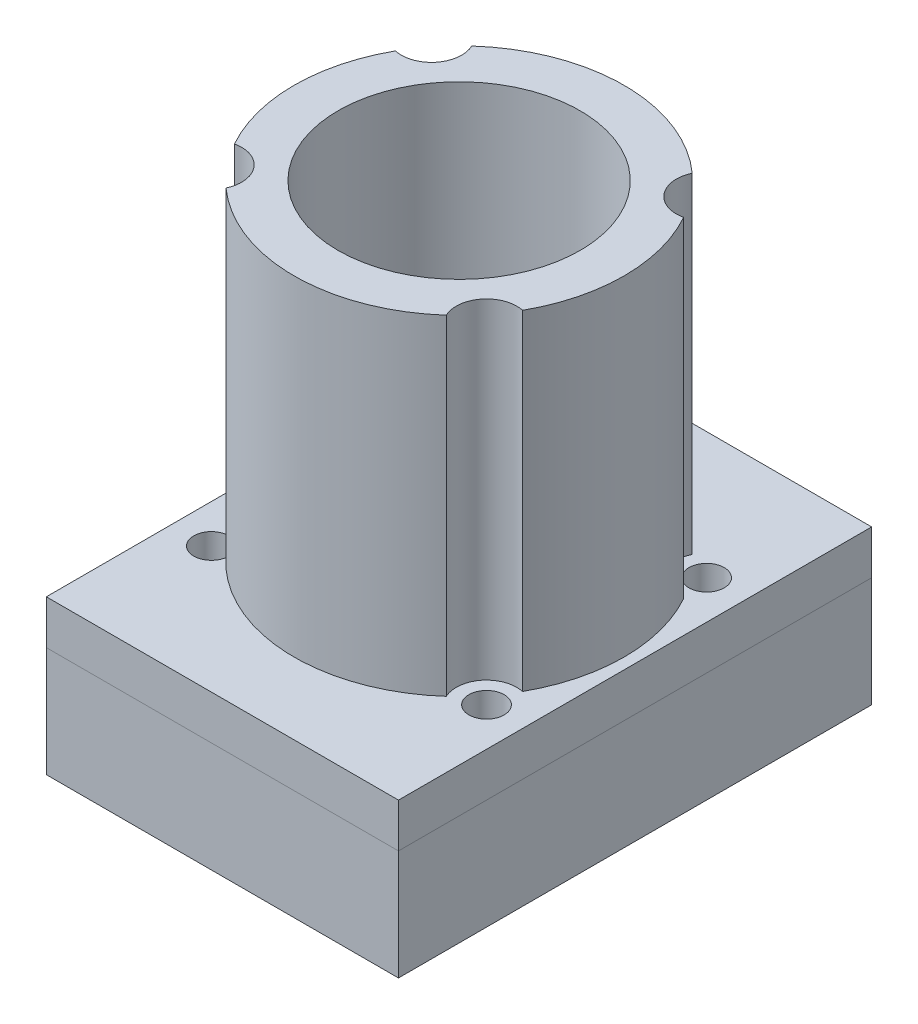
ISO-10303-21;
HEADER;
FILE_DESCRIPTION(('STEP AP214'),'2;1');
FILE_NAME('part.step','',(''),(''),'','','');
FILE_SCHEMA(('AUTOMOTIVE_DESIGN { 1 0 10303 214 1 1 1 1 }'));
ENDSEC;
DATA;
#1=APPLICATION_CONTEXT('core data for automotive mechanical design processes');
#2=APPLICATION_PROTOCOL_DEFINITION('international standard','automotive_design',2000,#1);
#3=PRODUCT_CONTEXT('',#1,'mechanical');
#4=PRODUCT('Part','Part','',(#3));
#5=PRODUCT_RELATED_PRODUCT_CATEGORY('part','',(#4));
#6=PRODUCT_DEFINITION_FORMATION('','',#4);
#7=PRODUCT_DEFINITION_CONTEXT('part definition',#1,'design');
#8=PRODUCT_DEFINITION('design','',#6,#7);
#9=PRODUCT_DEFINITION_SHAPE('','',#8);
#10=(LENGTH_UNIT() NAMED_UNIT(*) SI_UNIT(.MILLI.,.METRE.));
#11=(NAMED_UNIT(*) PLANE_ANGLE_UNIT() SI_UNIT($,.RADIAN.));
#12=(NAMED_UNIT(*) SI_UNIT($,.STERADIAN.) SOLID_ANGLE_UNIT());
#13=UNCERTAINTY_MEASURE_WITH_UNIT(LENGTH_MEASURE(1.E-05),#10,'distance_accuracy_value','');
#14=(GEOMETRIC_REPRESENTATION_CONTEXT(3) GLOBAL_UNCERTAINTY_ASSIGNED_CONTEXT((#13)) GLOBAL_UNIT_ASSIGNED_CONTEXT((#10,
#11,#12)) REPRESENTATION_CONTEXT('',''));
#15=CARTESIAN_POINT('',(0.,0.,0.));
#16=DIRECTION('',(0.,0.,1.));
#17=DIRECTION('',(1.,0.,0.));
#18=AXIS2_PLACEMENT_3D('',#15,#16,#17);
#19=CARTESIAN_POINT('',(-0.329036726473719,58.9480547552622,-9.99092979558486));
#20=DIRECTION('',(0.,-1.,0.));
#21=DIRECTION('',(0.,0.,-1.));
#22=AXIS2_PLACEMENT_3D('',#19,#20,#21);
#23=CYLINDRICAL_SURFACE('',#22,15.);
#24=DIRECTION('',(0.,-1.,0.));
#25=VECTOR('',#24,1.);
#26=CARTESIAN_POINT('',(-13.4198533282119,45.9480547552622,-2.66764360019029));
#27=LINE('',#26,#25);
#28=CARTESIAN_POINT('',(-13.4198533282119,58.9480547552622,-2.66764360019028));
#29=VERTEX_POINT('',#28);
#30=CARTESIAN_POINT('',(-13.4198533282119,28.9480547552622,-2.66764360019029));
#31=VERTEX_POINT('',#30);
#32=EDGE_CURVE('E12',#29,#31,#27,.T.);
#33=ORIENTED_EDGE('',*,*,#32,.F.);
#34=CARTESIAN_POINT('',(-0.329036726473719,58.9480547552622,-9.99092979558486));
#35=DIRECTION('',(0.,1.,0.));
#36=DIRECTION('',(0.,0.,1.));
#37=AXIS2_PLACEMENT_3D('',#34,#35,#36);
#38=CIRCLE('',#37,15.);
#39=CARTESIAN_POINT('',(-13.4288699327141,58.9480547552622,-17.2980749268027));
#40=VERTEX_POINT('',#39);
#41=EDGE_CURVE('E254',#40,#29,#38,.T.);
#42=ORIENTED_EDGE('',*,*,#41,.F.);
#43=DIRECTION('',(0.,-1.,0.));
#44=VECTOR('',#43,1.);
#45=CARTESIAN_POINT('',(-13.4288699327141,45.9480547552622,-17.2980749268027));
#46=LINE('',#45,#44);
#47=CARTESIAN_POINT('',(-13.4288699327141,28.9480547552622,-17.2980749268027));
#48=VERTEX_POINT('',#47);
#49=EDGE_CURVE('E157',#48,#40,#46,.F.);
#50=ORIENTED_EDGE('',*,*,#49,.F.);
#51=CARTESIAN_POINT('',(-0.329036726473719,28.9480547552622,-9.99092979558486));
#52=DIRECTION('',(0.,1.,0.));
#53=DIRECTION('',(0.,0.,1.));
#54=AXIS2_PLACEMENT_3D('',#51,#52,#53);
#55=CIRCLE('',#54,15.);
#56=EDGE_CURVE('E166',#48,#31,#55,.T.);
#57=ORIENTED_EDGE('',*,*,#56,.T.);
#58=EDGE_LOOP('',(#33,#42,#50,#57));
#59=FACE_BOUND('',#58,.T.);
#60=ADVANCED_FACE('F47',(#59),#23,.T.);
#61=DIRECTION('',(0.,-1.,0.));
#62=VECTOR('',#61,1.);
#63=CARTESIAN_POINT('',(-10.3374206699332,45.9480547552622,1.18190560284034));
#64=LINE('',#63,#62);
#65=CARTESIAN_POINT('',(-10.3374206699332,28.9480547552622,1.18190560284034));
#66=VERTEX_POINT('',#65);
#67=CARTESIAN_POINT('',(-10.3374206699332,58.9480547552622,1.18190560284034));
#68=VERTEX_POINT('',#67);
#69=EDGE_CURVE('E55',#66,#68,#64,.F.);
#70=ORIENTED_EDGE('',*,*,#69,.F.);
#71=CARTESIAN_POINT('',(9.67934721698572,28.9480547552622,1.18190560284034));
#72=VERTEX_POINT('',#71);
#73=EDGE_CURVE('E174',#66,#72,#55,.T.);
#74=ORIENTED_EDGE('',*,*,#73,.T.);
#75=DIRECTION('',(0.,-1.,0.));
#76=VECTOR('',#75,1.);
#77=CARTESIAN_POINT('',(9.67934721698572,45.9480547552622,1.18190560284034));
#78=LINE('',#77,#76);
#79=CARTESIAN_POINT('',(9.67934721698573,58.9480547552622,1.18190560284034));
#80=VERTEX_POINT('',#79);
#81=EDGE_CURVE('E237',#80,#72,#78,.T.);
#82=ORIENTED_EDGE('',*,*,#81,.F.);
#83=EDGE_CURVE('E179',#68,#80,#38,.T.);
#84=ORIENTED_EDGE('',*,*,#83,.F.);
#85=EDGE_LOOP('',(#70,#74,#82,#84));
#86=FACE_BOUND('',#85,.T.);
#87=ADVANCED_FACE('F259',(#86),#23,.T.);
#88=DIRECTION('',(0.,-1.,0.));
#89=VECTOR('',#88,1.);
#90=CARTESIAN_POINT('',(12.7617798752644,45.9480547552622,-2.66764360019029));
#91=LINE('',#90,#89);
#92=CARTESIAN_POINT('',(12.7617798752644,28.9480547552622,-2.66764360019029));
#93=VERTEX_POINT('',#92);
#94=CARTESIAN_POINT('',(12.7617798752644,58.9480547552622,-2.66764360019029));
#95=VERTEX_POINT('',#94);
#96=EDGE_CURVE('E235',#93,#95,#91,.F.);
#97=ORIENTED_EDGE('',*,*,#96,.F.);
#98=CARTESIAN_POINT('',(12.7707964797667,28.9480547552622,-17.2980749268027));
#99=VERTEX_POINT('',#98);
#100=EDGE_CURVE('E171',#93,#99,#55,.T.);
#101=ORIENTED_EDGE('',*,*,#100,.T.);
#102=DIRECTION('',(0.,-1.,0.));
#103=VECTOR('',#102,1.);
#104=CARTESIAN_POINT('',(12.7707964797667,45.9480547552622,-17.2980749268027));
#105=LINE('',#104,#103);
#106=CARTESIAN_POINT('',(12.7707964797667,58.9480547552622,-17.2980749268027));
#107=VERTEX_POINT('',#106);
#108=EDGE_CURVE('E233',#107,#99,#105,.T.);
#109=ORIENTED_EDGE('',*,*,#108,.F.);
#110=EDGE_CURVE('E188',#95,#107,#38,.T.);
#111=ORIENTED_EDGE('',*,*,#110,.F.);
#112=EDGE_LOOP('',(#97,#101,#109,#111));
#113=FACE_BOUND('',#112,.T.);
#114=ADVANCED_FACE('F276',(#113),#23,.T.);
#115=DIRECTION('',(0.,-1.,0.));
#116=VECTOR('',#115,1.);
#117=CARTESIAN_POINT('',(9.68534797677265,45.9480547552622,-21.1583869374496));
#118=LINE('',#117,#116);
#119=CARTESIAN_POINT('',(9.68534797677264,28.9480547552622,-21.1583869374496));
#120=VERTEX_POINT('',#119);
#121=CARTESIAN_POINT('',(9.68534797677264,58.9480547552622,-21.1583869374496));
#122=VERTEX_POINT('',#121);
#123=EDGE_CURVE('E156',#120,#122,#118,.F.);
#124=ORIENTED_EDGE('',*,*,#123,.F.);
#125=CARTESIAN_POINT('',(-10.3434214297201,28.9480547552622,-21.1583869374496));
#126=VERTEX_POINT('',#125);
#127=EDGE_CURVE('E163',#120,#126,#55,.T.);
#128=ORIENTED_EDGE('',*,*,#127,.T.);
#129=DIRECTION('',(0.,-1.,0.));
#130=VECTOR('',#129,1.);
#131=CARTESIAN_POINT('',(-10.3434214297201,45.9480547552622,-21.1583869374496));
#132=LINE('',#131,#130);
#133=CARTESIAN_POINT('',(-10.3434214297201,58.9480547552622,-21.1583869374496));
#134=VERTEX_POINT('',#133);
#135=EDGE_CURVE('E145',#134,#126,#132,.T.);
#136=ORIENTED_EDGE('',*,*,#135,.F.);
#137=EDGE_CURVE('E260',#122,#134,#38,.T.);
#138=ORIENTED_EDGE('',*,*,#137,.F.);
#139=EDGE_LOOP('',(#124,#128,#136,#138));
#140=FACE_BOUND('',#139,.T.);
#141=ADVANCED_FACE('F170',(#140),#23,.T.);
#142=CARTESIAN_POINT('',(0.,28.9480547552622,0.));
#143=DIRECTION('',(0.,1.,0.));
#144=DIRECTION('',(0.,0.,1.));
#145=AXIS2_PLACEMENT_3D('',#142,#143,#144);
#146=PLANE('',#145);
#147=ORIENTED_EDGE('',*,*,#73,.F.);
#148=CARTESIAN_POINT('',(-12.8290367264737,28.9480547552622,0.0181404088302802));
#149=DIRECTION('',(0.,1.,0.));
#150=DIRECTION('',(0.,0.,1.));
#151=AXIS2_PLACEMENT_3D('',#148,#149,#150);
#152=CIRCLE('',#151,2.75);
#153=EDGE_CURVE('E244',#66,#31,#152,.T.);
#154=ORIENTED_EDGE('',*,*,#153,.T.);
#155=ORIENTED_EDGE('',*,*,#56,.F.);
#156=CARTESIAN_POINT('',(-12.8290367264737,28.9480547552622,-19.9818595911697));
#157=DIRECTION('',(0.,1.,0.));
#158=DIRECTION('',(0.,0.,1.));
#159=AXIS2_PLACEMENT_3D('',#156,#157,#158);
#160=CIRCLE('',#159,2.75);
#161=EDGE_CURVE('E148',#48,#126,#160,.T.);
#162=ORIENTED_EDGE('',*,*,#161,.T.);
#163=ORIENTED_EDGE('',*,*,#127,.F.);
#164=CARTESIAN_POINT('',(12.1709632735263,28.9480547552622,-19.9818595911697));
#165=DIRECTION('',(0.,1.,0.));
#166=DIRECTION('',(0.,0.,1.));
#167=AXIS2_PLACEMENT_3D('',#164,#165,#166);
#168=CIRCLE('',#167,2.75);
#169=EDGE_CURVE('E167',#120,#99,#168,.T.);
#170=ORIENTED_EDGE('',*,*,#169,.T.);
#171=ORIENTED_EDGE('',*,*,#100,.F.);
#172=CARTESIAN_POINT('',(12.1709632735263,28.9480547552622,0.0181404088302802));
#173=DIRECTION('',(0.,1.,0.));
#174=DIRECTION('',(0.,0.,1.));
#175=AXIS2_PLACEMENT_3D('',#172,#173,#174);
#176=CIRCLE('',#175,2.75);
#177=EDGE_CURVE('E62',#93,#72,#176,.T.);
#178=ORIENTED_EDGE('',*,*,#177,.T.);
#179=EDGE_LOOP('',(#147,#154,#155,#162,#163,#170,#171,#178));
#180=FACE_BOUND('',#179,.T.);
#181=DIRECTION('',(1.,0.,0.));
#182=VECTOR('',#181,1.);
#183=CARTESIAN_POINT('',(-16.3290367264737,28.9480547552622,11.5181404088303));
#184=LINE('',#183,#182);
#185=CARTESIAN_POINT('',(-16.3290367264737,28.9480547552622,11.5181404088303));
#186=VERTEX_POINT('',#185);
#187=CARTESIAN_POINT('',(15.6709632735263,28.9480547552622,11.5181404088303));
#188=VERTEX_POINT('',#187);
#189=EDGE_CURVE('E210',#186,#188,#184,.T.);
#190=ORIENTED_EDGE('',*,*,#189,.T.);
#191=DIRECTION('',(0.,0.,-1.));
#192=VECTOR('',#191,1.);
#193=CARTESIAN_POINT('',(15.6709632735263,28.9480547552622,11.5181404088303));
#194=LINE('',#193,#192);
#195=CARTESIAN_POINT('',(15.6709632735263,28.9480547552622,-31.4818595911697));
#196=VERTEX_POINT('',#195);
#197=EDGE_CURVE('E100',#188,#196,#194,.T.);
#198=ORIENTED_EDGE('',*,*,#197,.T.);
#199=DIRECTION('',(-1.,0.,0.));
#200=VECTOR('',#199,1.);
#201=CARTESIAN_POINT('',(15.6709632735263,28.9480547552622,-31.4818595911697));
#202=LINE('',#201,#200);
#203=CARTESIAN_POINT('',(-16.3290367264737,28.9480547552622,-31.4818595911697));
#204=VERTEX_POINT('',#203);
#205=EDGE_CURVE('E213',#196,#204,#202,.T.);
#206=ORIENTED_EDGE('',*,*,#205,.T.);
#207=DIRECTION('',(0.,0.,1.));
#208=VECTOR('',#207,1.);
#209=CARTESIAN_POINT('',(-16.3290367264737,28.9480547552622,-31.4818595911697));
#210=LINE('',#209,#208);
#211=EDGE_CURVE('E71',#204,#186,#210,.T.);
#212=ORIENTED_EDGE('',*,*,#211,.T.);
#213=EDGE_LOOP('',(#190,#198,#206,#212));
#214=FACE_BOUND('',#213,.T.);
#215=CARTESIAN_POINT('',(-12.8290367264737,28.9480547552622,-19.9818595911697));
#216=DIRECTION('',(0.,1.,0.));
#217=DIRECTION('',(0.,0.,1.));
#218=AXIS2_PLACEMENT_3D('',#215,#216,#217);
#219=CIRCLE('',#218,1.6);
#220=CARTESIAN_POINT('',(-12.8290367264737,28.9480547552622,-18.3818595911697));
#221=VERTEX_POINT('',#220);
#222=EDGE_CURVE('E189',#221,#221,#219,.T.);
#223=ORIENTED_EDGE('',*,*,#222,.F.);
#224=EDGE_LOOP('',(#223));
#225=FACE_BOUND('',#224,.T.);
#226=CARTESIAN_POINT('',(12.1709632735263,28.9480547552622,-19.9818595911697));
#227=DIRECTION('',(0.,1.,0.));
#228=DIRECTION('',(0.,0.,1.));
#229=AXIS2_PLACEMENT_3D('',#226,#227,#228);
#230=CIRCLE('',#229,1.6);
#231=CARTESIAN_POINT('',(12.1709632735263,28.9480547552622,-18.3818595911697));
#232=VERTEX_POINT('',#231);
#233=EDGE_CURVE('E181',#232,#232,#230,.T.);
#234=ORIENTED_EDGE('',*,*,#233,.F.);
#235=EDGE_LOOP('',(#234));
#236=FACE_BOUND('',#235,.T.);
#237=CARTESIAN_POINT('',(12.1709632735263,28.9480547552622,0.0181404088302802));
#238=DIRECTION('',(0.,1.,0.));
#239=DIRECTION('',(0.,0.,1.));
#240=AXIS2_PLACEMENT_3D('',#237,#238,#239);
#241=CIRCLE('',#240,1.6);
#242=CARTESIAN_POINT('',(12.1709632735263,28.9480547552622,1.61814040883028));
#243=VERTEX_POINT('',#242);
#244=EDGE_CURVE('E201',#243,#243,#241,.T.);
#245=ORIENTED_EDGE('',*,*,#244,.F.);
#246=EDGE_LOOP('',(#245));
#247=FACE_BOUND('',#246,.T.);
#248=CARTESIAN_POINT('',(-12.8290367264737,28.9480547552622,0.0181404088302802));
#249=DIRECTION('',(0.,1.,0.));
#250=DIRECTION('',(0.,0.,1.));
#251=AXIS2_PLACEMENT_3D('',#248,#249,#250);
#252=CIRCLE('',#251,1.6);
#253=CARTESIAN_POINT('',(-12.8290367264737,28.9480547552622,1.61814040883028));
#254=VERTEX_POINT('',#253);
#255=EDGE_CURVE('E195',#254,#254,#252,.T.);
#256=ORIENTED_EDGE('',*,*,#255,.F.);
#257=EDGE_LOOP('',(#256));
#258=FACE_BOUND('',#257,.T.);
#259=ADVANCED_FACE('F161',(#180,#214,#225,#236,#247,#258),#146,.T.);
#260=CARTESIAN_POINT('',(0.,24.9480547552622,0.));
#261=DIRECTION('',(0.,1.,0.));
#262=DIRECTION('',(0.,0.,1.));
#263=AXIS2_PLACEMENT_3D('',#260,#261,#262);
#264=PLANE('',#263);
#265=DIRECTION('',(1.,0.,0.));
#266=VECTOR('',#265,1.);
#267=CARTESIAN_POINT('',(-16.3290367264737,24.9480547552622,11.5181404088303));
#268=LINE('',#267,#266);
#269=CARTESIAN_POINT('',(-16.3290367264737,24.9480547552622,11.5181404088303));
#270=VERTEX_POINT('',#269);
#271=CARTESIAN_POINT('',(15.6709632735263,24.9480547552622,11.5181404088303));
#272=VERTEX_POINT('',#271);
#273=EDGE_CURVE('E209',#270,#272,#268,.T.);
#274=ORIENTED_EDGE('',*,*,#273,.F.);
#275=DIRECTION('',(0.,0.,1.));
#276=VECTOR('',#275,1.);
#277=CARTESIAN_POINT('',(-16.3290367264737,24.9480547552622,-31.4818595911697));
#278=LINE('',#277,#276);
#279=CARTESIAN_POINT('',(-16.3290367264737,24.9480547552622,-31.4818595911697));
#280=VERTEX_POINT('',#279);
#281=EDGE_CURVE('E92',#280,#270,#278,.T.);
#282=ORIENTED_EDGE('',*,*,#281,.F.);
#283=DIRECTION('',(-1.,0.,0.));
#284=VECTOR('',#283,1.);
#285=CARTESIAN_POINT('',(15.6709632735263,24.9480547552622,-31.4818595911697));
#286=LINE('',#285,#284);
#287=CARTESIAN_POINT('',(15.6709632735263,24.9480547552622,-31.4818595911697));
#288=VERTEX_POINT('',#287);
#289=EDGE_CURVE('E221',#288,#280,#286,.T.);
#290=ORIENTED_EDGE('',*,*,#289,.F.);
#291=DIRECTION('',(0.,0.,-1.));
#292=VECTOR('',#291,1.);
#293=CARTESIAN_POINT('',(15.6709632735263,24.9480547552622,11.5181404088303));
#294=LINE('',#293,#292);
#295=EDGE_CURVE('E219',#272,#288,#294,.T.);
#296=ORIENTED_EDGE('',*,*,#295,.F.);
#297=EDGE_LOOP('',(#274,#282,#290,#296));
#298=FACE_BOUND('',#297,.T.);
#299=CARTESIAN_POINT('',(-0.329036726473719,24.9480547552622,-9.99092979558486));
#300=DIRECTION('',(0.,1.,0.));
#301=DIRECTION('',(0.,0.,1.));
#302=AXIS2_PLACEMENT_3D('',#299,#300,#301);
#303=CIRCLE('',#302,11.);
#304=CARTESIAN_POINT('',(-0.329036726473719,24.9480547552622,1.00907020441514));
#305=VERTEX_POINT('',#304);
#306=EDGE_CURVE('E204',#305,#305,#303,.T.);
#307=ORIENTED_EDGE('',*,*,#306,.T.);
#308=EDGE_LOOP('',(#307));
#309=FACE_BOUND('',#308,.T.);
#310=CARTESIAN_POINT('',(12.1709632735263,24.9480547552622,0.0181404088302802));
#311=DIRECTION('',(0.,1.,0.));
#312=DIRECTION('',(0.,0.,1.));
#313=AXIS2_PLACEMENT_3D('',#310,#311,#312);
#314=CIRCLE('',#313,1.6);
#315=CARTESIAN_POINT('',(12.1709632735263,24.9480547552622,1.61814040883028));
#316=VERTEX_POINT('',#315);
#317=EDGE_CURVE('E198',#316,#316,#314,.T.);
#318=ORIENTED_EDGE('',*,*,#317,.T.);
#319=EDGE_LOOP('',(#318));
#320=FACE_BOUND('',#319,.T.);
#321=CARTESIAN_POINT('',(-12.8290367264737,24.9480547552622,0.0181404088302802));
#322=DIRECTION('',(0.,1.,0.));
#323=DIRECTION('',(0.,0.,1.));
#324=AXIS2_PLACEMENT_3D('',#321,#322,#323);
#325=CIRCLE('',#324,1.6);
#326=CARTESIAN_POINT('',(-12.8290367264737,24.9480547552622,1.61814040883028));
#327=VERTEX_POINT('',#326);
#328=EDGE_CURVE('E192',#327,#327,#325,.T.);
#329=ORIENTED_EDGE('',*,*,#328,.T.);
#330=EDGE_LOOP('',(#329));
#331=FACE_BOUND('',#330,.T.);
#332=CARTESIAN_POINT('',(-12.8290367264737,24.9480547552622,-19.9818595911697));
#333=DIRECTION('',(0.,1.,0.));
#334=DIRECTION('',(0.,0.,1.));
#335=AXIS2_PLACEMENT_3D('',#332,#333,#334);
#336=CIRCLE('',#335,1.6);
#337=CARTESIAN_POINT('',(-12.8290367264737,24.9480547552622,-18.3818595911697));
#338=VERTEX_POINT('',#337);
#339=EDGE_CURVE('E184',#338,#338,#336,.T.);
#340=ORIENTED_EDGE('',*,*,#339,.T.);
#341=EDGE_LOOP('',(#340));
#342=FACE_BOUND('',#341,.T.);
#343=CARTESIAN_POINT('',(12.1709632735263,24.9480547552622,-19.9818595911697));
#344=DIRECTION('',(0.,1.,0.));
#345=DIRECTION('',(0.,0.,1.));
#346=AXIS2_PLACEMENT_3D('',#343,#344,#345);
#347=CIRCLE('',#346,1.6);
#348=CARTESIAN_POINT('',(12.1709632735263,24.9480547552622,-18.3818595911697));
#349=VERTEX_POINT('',#348);
#350=EDGE_CURVE('E185',#349,#349,#347,.T.);
#351=ORIENTED_EDGE('',*,*,#350,.T.);
#352=EDGE_LOOP('',(#351));
#353=FACE_BOUND('',#352,.T.);
#354=ADVANCED_FACE('F292',(#298,#309,#320,#331,#342,#353),#264,.F.);
#355=CARTESIAN_POINT('',(-16.3290367264737,28.9480547552622,11.5181404088303));
#356=DIRECTION('',(0.,0.,-1.));
#357=DIRECTION('',(-1.,0.,0.));
#358=AXIS2_PLACEMENT_3D('',#355,#356,#357);
#359=PLANE('',#358);
#360=ORIENTED_EDGE('',*,*,#273,.T.);
#361=DIRECTION('',(0.,-1.,0.));
#362=VECTOR('',#361,1.);
#363=CARTESIAN_POINT('',(15.6709632735263,28.9480547552622,11.5181404088303));
#364=LINE('',#363,#362);
#365=EDGE_CURVE('E178',#188,#272,#364,.T.);
#366=ORIENTED_EDGE('',*,*,#365,.F.);
#367=ORIENTED_EDGE('',*,*,#189,.F.);
#368=DIRECTION('',(0.,-1.,0.));
#369=VECTOR('',#368,1.);
#370=CARTESIAN_POINT('',(-16.3290367264737,28.9480547552622,11.5181404088303));
#371=LINE('',#370,#369);
#372=EDGE_CURVE('E216',#186,#270,#371,.T.);
#373=ORIENTED_EDGE('',*,*,#372,.T.);
#374=EDGE_LOOP('',(#360,#366,#367,#373));
#375=FACE_BOUND('',#374,.T.);
#376=ADVANCED_FACE('F49',(#375),#359,.F.);
#377=CARTESIAN_POINT('',(15.6709632735263,28.9480547552622,11.5181404088303));
#378=DIRECTION('',(-1.,0.,0.));
#379=DIRECTION('',(0.,0.,1.));
#380=AXIS2_PLACEMENT_3D('',#377,#378,#379);
#381=PLANE('',#380);
#382=ORIENTED_EDGE('',*,*,#295,.T.);
#383=DIRECTION('',(0.,-1.,0.));
#384=VECTOR('',#383,1.);
#385=CARTESIAN_POINT('',(15.6709632735263,28.9480547552622,-31.4818595911697));
#386=LINE('',#385,#384);
#387=EDGE_CURVE('E227',#196,#288,#386,.T.);
#388=ORIENTED_EDGE('',*,*,#387,.F.);
#389=ORIENTED_EDGE('',*,*,#197,.F.);
#390=ORIENTED_EDGE('',*,*,#365,.T.);
#391=EDGE_LOOP('',(#382,#388,#389,#390));
#392=FACE_BOUND('',#391,.T.);
#393=ADVANCED_FACE('F339',(#392),#381,.F.);
#394=CARTESIAN_POINT('',(15.6709632735263,28.9480547552622,-31.4818595911697));
#395=DIRECTION('',(0.,0.,1.));
#396=DIRECTION('',(1.,0.,0.));
#397=AXIS2_PLACEMENT_3D('',#394,#395,#396);
#398=PLANE('',#397);
#399=ORIENTED_EDGE('',*,*,#289,.T.);
#400=DIRECTION('',(0.,-1.,0.));
#401=VECTOR('',#400,1.);
#402=CARTESIAN_POINT('',(-16.3290367264737,28.9480547552622,-31.4818595911697));
#403=LINE('',#402,#401);
#404=EDGE_CURVE('E225',#204,#280,#403,.T.);
#405=ORIENTED_EDGE('',*,*,#404,.F.);
#406=ORIENTED_EDGE('',*,*,#205,.F.);
#407=ORIENTED_EDGE('',*,*,#387,.T.);
#408=EDGE_LOOP('',(#399,#405,#406,#407));
#409=FACE_BOUND('',#408,.T.);
#410=ADVANCED_FACE('F330',(#409),#398,.F.);
#411=CARTESIAN_POINT('',(-16.3290367264737,28.9480547552622,-31.4818595911697));
#412=DIRECTION('',(1.,0.,0.));
#413=DIRECTION('',(0.,0.,-1.));
#414=AXIS2_PLACEMENT_3D('',#411,#412,#413);
#415=PLANE('',#414);
#416=ORIENTED_EDGE('',*,*,#281,.T.);
#417=ORIENTED_EDGE('',*,*,#372,.F.);
#418=ORIENTED_EDGE('',*,*,#211,.F.);
#419=ORIENTED_EDGE('',*,*,#404,.T.);
#420=EDGE_LOOP('',(#416,#417,#418,#419));
#421=FACE_BOUND('',#420,.T.);
#422=ADVANCED_FACE('F316',(#421),#415,.F.);
#423=CARTESIAN_POINT('',(-0.329036726473719,28.9480547552622,-9.99092979558486));
#424=DIRECTION('',(0.,-1.,0.));
#425=DIRECTION('',(0.,0.,-1.));
#426=AXIS2_PLACEMENT_3D('',#423,#424,#425);
#427=CYLINDRICAL_SURFACE('',#426,11.);
#428=ORIENTED_EDGE('',*,*,#306,.F.);
#429=EDGE_LOOP('',(#428));
#430=FACE_BOUND('',#429,.T.);
#431=CARTESIAN_POINT('',(-0.329036726473719,58.9480547552622,-9.99092979558486));
#432=DIRECTION('',(0.,1.,0.));
#433=DIRECTION('',(0.,0.,1.));
#434=AXIS2_PLACEMENT_3D('',#431,#432,#433);
#435=CIRCLE('',#434,11.);
#436=CARTESIAN_POINT('',(-0.329036726473719,58.9480547552622,1.00907020441514));
#437=VERTEX_POINT('',#436);
#438=EDGE_CURVE('E255',#437,#437,#435,.T.);
#439=ORIENTED_EDGE('',*,*,#438,.T.);
#440=EDGE_LOOP('',(#439));
#441=FACE_BOUND('',#440,.T.);
#442=ADVANCED_FACE('F310',(#430,#441),#427,.F.);
#443=CARTESIAN_POINT('',(12.1709632735263,28.9480547552622,0.0181404088302802));
#444=DIRECTION('',(0.,-1.,0.));
#445=DIRECTION('',(0.,0.,-1.));
#446=AXIS2_PLACEMENT_3D('',#443,#444,#445);
#447=CYLINDRICAL_SURFACE('',#446,1.6);
#448=ORIENTED_EDGE('',*,*,#244,.T.);
#449=EDGE_LOOP('',(#448));
#450=FACE_BOUND('',#449,.T.);
#451=ORIENTED_EDGE('',*,*,#317,.F.);
#452=EDGE_LOOP('',(#451));
#453=FACE_BOUND('',#452,.T.);
#454=ADVANCED_FACE('F315',(#450,#453),#447,.F.);
#455=CARTESIAN_POINT('',(-12.8290367264737,28.9480547552622,0.0181404088302802));
#456=DIRECTION('',(0.,-1.,0.));
#457=DIRECTION('',(0.,0.,-1.));
#458=AXIS2_PLACEMENT_3D('',#455,#456,#457);
#459=CYLINDRICAL_SURFACE('',#458,1.6);
#460=ORIENTED_EDGE('',*,*,#255,.T.);
#461=EDGE_LOOP('',(#460));
#462=FACE_BOUND('',#461,.T.);
#463=ORIENTED_EDGE('',*,*,#328,.F.);
#464=EDGE_LOOP('',(#463));
#465=FACE_BOUND('',#464,.T.);
#466=ADVANCED_FACE('F381',(#462,#465),#459,.F.);
#467=CARTESIAN_POINT('',(-12.8290367264737,28.9480547552622,-19.9818595911697));
#468=DIRECTION('',(0.,-1.,0.));
#469=DIRECTION('',(0.,0.,-1.));
#470=AXIS2_PLACEMENT_3D('',#467,#468,#469);
#471=CYLINDRICAL_SURFACE('',#470,1.6);
#472=ORIENTED_EDGE('',*,*,#222,.T.);
#473=EDGE_LOOP('',(#472));
#474=FACE_BOUND('',#473,.T.);
#475=ORIENTED_EDGE('',*,*,#339,.F.);
#476=EDGE_LOOP('',(#475));
#477=FACE_BOUND('',#476,.T.);
#478=ADVANCED_FACE('F391',(#474,#477),#471,.F.);
#479=CARTESIAN_POINT('',(12.1709632735263,28.9480547552622,-19.9818595911697));
#480=DIRECTION('',(0.,-1.,0.));
#481=DIRECTION('',(0.,0.,-1.));
#482=AXIS2_PLACEMENT_3D('',#479,#480,#481);
#483=CYLINDRICAL_SURFACE('',#482,1.6);
#484=ORIENTED_EDGE('',*,*,#233,.T.);
#485=EDGE_LOOP('',(#484));
#486=FACE_BOUND('',#485,.T.);
#487=ORIENTED_EDGE('',*,*,#350,.F.);
#488=EDGE_LOOP('',(#487));
#489=FACE_BOUND('',#488,.T.);
#490=ADVANCED_FACE('F401',(#486,#489),#483,.F.);
#491=CARTESIAN_POINT('',(-0.329036726473719,58.9480547552622,-9.99092979558486));
#492=DIRECTION('',(0.,1.,0.));
#493=DIRECTION('',(0.,0.,1.));
#494=AXIS2_PLACEMENT_3D('',#491,#492,#493);
#495=PLANE('',#494);
#496=ORIENTED_EDGE('',*,*,#41,.T.);
#497=CARTESIAN_POINT('',(-12.8290367264737,58.9480547552622,0.0181404088302802));
#498=DIRECTION('',(0.,1.,0.));
#499=DIRECTION('',(0.,0.,1.));
#500=AXIS2_PLACEMENT_3D('',#497,#498,#499);
#501=CIRCLE('',#500,2.75);
#502=EDGE_CURVE('E242',#29,#68,#501,.F.);
#503=ORIENTED_EDGE('',*,*,#502,.T.);
#504=ORIENTED_EDGE('',*,*,#83,.T.);
#505=CARTESIAN_POINT('',(12.1709632735263,58.9480547552622,0.0181404088302802));
#506=DIRECTION('',(0.,1.,0.));
#507=DIRECTION('',(0.,0.,1.));
#508=AXIS2_PLACEMENT_3D('',#505,#506,#507);
#509=CIRCLE('',#508,2.75);
#510=EDGE_CURVE('E256',#80,#95,#509,.F.);
#511=ORIENTED_EDGE('',*,*,#510,.T.);
#512=ORIENTED_EDGE('',*,*,#110,.T.);
#513=CARTESIAN_POINT('',(12.1709632735263,58.9480547552622,-19.9818595911697));
#514=DIRECTION('',(0.,1.,0.));
#515=DIRECTION('',(0.,0.,1.));
#516=AXIS2_PLACEMENT_3D('',#513,#514,#515);
#517=CIRCLE('',#516,2.75);
#518=EDGE_CURVE('E265',#107,#122,#517,.F.);
#519=ORIENTED_EDGE('',*,*,#518,.T.);
#520=ORIENTED_EDGE('',*,*,#137,.T.);
#521=CARTESIAN_POINT('',(-12.8290367264737,58.9480547552622,-19.9818595911697));
#522=DIRECTION('',(0.,1.,0.));
#523=DIRECTION('',(0.,0.,1.));
#524=AXIS2_PLACEMENT_3D('',#521,#522,#523);
#525=CIRCLE('',#524,2.75);
#526=EDGE_CURVE('E151',#134,#40,#525,.F.);
#527=ORIENTED_EDGE('',*,*,#526,.T.);
#528=EDGE_LOOP('',(#496,#503,#504,#511,#512,#519,#520,#527));
#529=FACE_BOUND('',#528,.T.);
#530=ORIENTED_EDGE('',*,*,#438,.F.);
#531=EDGE_LOOP('',(#530));
#532=FACE_BOUND('',#531,.T.);
#533=ADVANCED_FACE('F250',(#529,#532),#495,.T.);
#534=CARTESIAN_POINT('',(-12.8290367264737,62.9480547552622,-19.9818595911697));
#535=DIRECTION('',(0.,-1.,0.));
#536=DIRECTION('',(0.,0.,-1.));
#537=AXIS2_PLACEMENT_3D('',#534,#535,#536);
#538=CYLINDRICAL_SURFACE('',#537,2.75);
#539=ORIENTED_EDGE('',*,*,#135,.T.);
#540=ORIENTED_EDGE('',*,*,#161,.F.);
#541=ORIENTED_EDGE('',*,*,#49,.T.);
#542=ORIENTED_EDGE('',*,*,#526,.F.);
#543=EDGE_LOOP('',(#539,#540,#541,#542));
#544=FACE_BOUND('',#543,.T.);
#545=ADVANCED_FACE('F147',(#544),#538,.F.);
#546=CARTESIAN_POINT('',(12.1709632735263,62.9480547552622,-19.9818595911697));
#547=DIRECTION('',(0.,-1.,0.));
#548=DIRECTION('',(0.,0.,-1.));
#549=AXIS2_PLACEMENT_3D('',#546,#547,#548);
#550=CYLINDRICAL_SURFACE('',#549,2.75);
#551=ORIENTED_EDGE('',*,*,#108,.T.);
#552=ORIENTED_EDGE('',*,*,#169,.F.);
#553=ORIENTED_EDGE('',*,*,#123,.T.);
#554=ORIENTED_EDGE('',*,*,#518,.F.);
#555=EDGE_LOOP('',(#551,#552,#553,#554));
#556=FACE_BOUND('',#555,.T.);
#557=ADVANCED_FACE('F423',(#556),#550,.F.);
#558=CARTESIAN_POINT('',(12.1709632735263,62.9480547552622,0.0181404088302802));
#559=DIRECTION('',(0.,-1.,0.));
#560=DIRECTION('',(0.,0.,-1.));
#561=AXIS2_PLACEMENT_3D('',#558,#559,#560);
#562=CYLINDRICAL_SURFACE('',#561,2.75);
#563=ORIENTED_EDGE('',*,*,#81,.T.);
#564=ORIENTED_EDGE('',*,*,#177,.F.);
#565=ORIENTED_EDGE('',*,*,#96,.T.);
#566=ORIENTED_EDGE('',*,*,#510,.F.);
#567=EDGE_LOOP('',(#563,#564,#565,#566));
#568=FACE_BOUND('',#567,.T.);
#569=ADVANCED_FACE('F278',(#568),#562,.F.);
#570=CARTESIAN_POINT('',(-12.8290367264737,62.9480547552622,0.0181404088302802));
#571=DIRECTION('',(0.,-1.,0.));
#572=DIRECTION('',(0.,0.,-1.));
#573=AXIS2_PLACEMENT_3D('',#570,#571,#572);
#574=CYLINDRICAL_SURFACE('',#573,2.75);
#575=ORIENTED_EDGE('',*,*,#32,.T.);
#576=ORIENTED_EDGE('',*,*,#153,.F.);
#577=ORIENTED_EDGE('',*,*,#69,.T.);
#578=ORIENTED_EDGE('',*,*,#502,.F.);
#579=EDGE_LOOP('',(#575,#576,#577,#578));
#580=FACE_BOUND('',#579,.T.);
#581=ADVANCED_FACE('F241',(#580),#574,.F.);
#582=CLOSED_SHELL('',(#60,#87,#114,#141,#259,#354,#376,#393,#410,#422,#442,#454,#466,#478,#490,
#533,#545,#557,#569,#581));
#583=MANIFOLD_SOLID_BREP('B2',#582);
#584=CARTESIAN_POINT('',(15.6709632735263,24.9480547552622,11.5181404088303));
#585=DIRECTION('',(-1.,0.,0.));
#586=DIRECTION('',(0.,0.,1.));
#587=AXIS2_PLACEMENT_3D('',#584,#585,#586);
#588=PLANE('',#587);
#589=DIRECTION('',(0.,0.,-1.));
#590=VECTOR('',#589,1.);
#591=CARTESIAN_POINT('',(15.6709632735263,14.9480547552622,11.5181404088303));
#592=LINE('',#591,#590);
#593=CARTESIAN_POINT('',(15.6709632735263,14.9480547552622,11.5181404088303));
#594=VERTEX_POINT('',#593);
#595=CARTESIAN_POINT('',(15.6709632735263,14.9480547552622,-31.4818595911697));
#596=VERTEX_POINT('',#595);
#597=EDGE_CURVE('E555',#594,#596,#592,.T.);
#598=ORIENTED_EDGE('',*,*,#597,.T.);
#599=DIRECTION('',(0.,-1.,0.));
#600=VECTOR('',#599,1.);
#601=CARTESIAN_POINT('',(15.6709632735263,24.9480547552622,-31.4818595911697));
#602=LINE('',#601,#600);
#603=CARTESIAN_POINT('',(15.6709632735263,24.9480547552622,-31.4818595911697));
#604=VERTEX_POINT('',#603);
#605=EDGE_CURVE('E45',#604,#596,#602,.T.);
#606=ORIENTED_EDGE('',*,*,#605,.F.);
#607=DIRECTION('',(0.,0.,-1.));
#608=VECTOR('',#607,1.);
#609=CARTESIAN_POINT('',(15.6709632735263,24.9480547552622,11.5181404088303));
#610=LINE('',#609,#608);
#611=CARTESIAN_POINT('',(15.6709632735263,24.9480547552622,11.5181404088303));
#612=VERTEX_POINT('',#611);
#613=EDGE_CURVE('E543',#612,#604,#610,.T.);
#614=ORIENTED_EDGE('',*,*,#613,.F.);
#615=DIRECTION('',(0.,-1.,0.));
#616=VECTOR('',#615,1.);
#617=CARTESIAN_POINT('',(15.6709632735263,24.9480547552622,11.5181404088303));
#618=LINE('',#617,#616);
#619=EDGE_CURVE('E551',#612,#594,#618,.T.);
#620=ORIENTED_EDGE('',*,*,#619,.T.);
#621=EDGE_LOOP('',(#598,#606,#614,#620));
#622=FACE_BOUND('',#621,.T.);
#623=ADVANCED_FACE('F492',(#622),#588,.F.);
#624=CARTESIAN_POINT('',(-16.3290367264737,24.9480547552622,-31.4818595911697));
#625=DIRECTION('',(0.,0.,1.));
#626=DIRECTION('',(1.,0.,0.));
#627=AXIS2_PLACEMENT_3D('',#624,#625,#626);
#628=PLANE('',#627);
#629=DIRECTION('',(-1.,0.,0.));
#630=VECTOR('',#629,1.);
#631=CARTESIAN_POINT('',(-16.3290367264737,14.9480547552622,-31.4818595911697));
#632=LINE('',#631,#630);
#633=CARTESIAN_POINT('',(-16.3290367264737,14.9480547552622,-31.4818595911697));
#634=VERTEX_POINT('',#633);
#635=EDGE_CURVE('E547',#596,#634,#632,.T.);
#636=ORIENTED_EDGE('',*,*,#635,.T.);
#637=DIRECTION('',(0.,-1.,0.));
#638=VECTOR('',#637,1.);
#639=CARTESIAN_POINT('',(-16.3290367264737,24.9480547552622,-31.4818595911697));
#640=LINE('',#639,#638);
#641=CARTESIAN_POINT('',(-16.3290367264737,24.9480547552622,-31.4818595911697));
#642=VERTEX_POINT('',#641);
#643=EDGE_CURVE('E500',#642,#634,#640,.T.);
#644=ORIENTED_EDGE('',*,*,#643,.F.);
#645=DIRECTION('',(-1.,0.,0.));
#646=VECTOR('',#645,1.);
#647=CARTESIAN_POINT('',(-16.3290367264737,24.9480547552622,-31.4818595911697));
#648=LINE('',#647,#646);
#649=EDGE_CURVE('E538',#604,#642,#648,.T.);
#650=ORIENTED_EDGE('',*,*,#649,.F.);
#651=ORIENTED_EDGE('',*,*,#605,.T.);
#652=EDGE_LOOP('',(#636,#644,#650,#651));
#653=FACE_BOUND('',#652,.T.);
#654=ADVANCED_FACE('F546',(#653),#628,.F.);
#655=CARTESIAN_POINT('',(-16.3290367264737,24.9480547552622,11.5181404088303));
#656=DIRECTION('',(1.,0.,0.));
#657=DIRECTION('',(0.,0.,-1.));
#658=AXIS2_PLACEMENT_3D('',#655,#656,#657);
#659=PLANE('',#658);
#660=DIRECTION('',(0.,0.,1.));
#661=VECTOR('',#660,1.);
#662=CARTESIAN_POINT('',(-16.3290367264737,14.9480547552622,11.5181404088303));
#663=LINE('',#662,#661);
#664=CARTESIAN_POINT('',(-16.3290367264737,14.9480547552622,11.5181404088303));
#665=VERTEX_POINT('',#664);
#666=EDGE_CURVE('E525',#634,#665,#663,.T.);
#667=ORIENTED_EDGE('',*,*,#666,.T.);
#668=DIRECTION('',(0.,-1.,0.));
#669=VECTOR('',#668,1.);
#670=CARTESIAN_POINT('',(-16.3290367264737,24.9480547552622,11.5181404088303));
#671=LINE('',#670,#669);
#672=CARTESIAN_POINT('',(-16.3290367264737,24.9480547552622,11.5181404088303));
#673=VERTEX_POINT('',#672);
#674=EDGE_CURVE('E548',#673,#665,#671,.T.);
#675=ORIENTED_EDGE('',*,*,#674,.F.);
#676=DIRECTION('',(0.,0.,1.));
#677=VECTOR('',#676,1.);
#678=CARTESIAN_POINT('',(-16.3290367264737,24.9480547552622,11.5181404088303));
#679=LINE('',#678,#677);
#680=EDGE_CURVE('E541',#642,#673,#679,.T.);
#681=ORIENTED_EDGE('',*,*,#680,.F.);
#682=ORIENTED_EDGE('',*,*,#643,.T.);
#683=EDGE_LOOP('',(#667,#675,#681,#682));
#684=FACE_BOUND('',#683,.T.);
#685=ADVANCED_FACE('F549',(#684),#659,.F.);
#686=CARTESIAN_POINT('',(-16.3290367264737,24.9480547552622,11.5181404088303));
#687=DIRECTION('',(0.,0.,-1.));
#688=DIRECTION('',(-1.,0.,0.));
#689=AXIS2_PLACEMENT_3D('',#686,#687,#688);
#690=PLANE('',#689);
#691=DIRECTION('',(1.,0.,0.));
#692=VECTOR('',#691,1.);
#693=CARTESIAN_POINT('',(-16.3290367264737,14.9480547552622,11.5181404088303));
#694=LINE('',#693,#692);
#695=EDGE_CURVE('E531',#665,#594,#694,.T.);
#696=ORIENTED_EDGE('',*,*,#695,.T.);
#697=ORIENTED_EDGE('',*,*,#619,.F.);
#698=DIRECTION('',(1.,0.,0.));
#699=VECTOR('',#698,1.);
#700=CARTESIAN_POINT('',(-16.3290367264737,24.9480547552622,11.5181404088303));
#701=LINE('',#700,#699);
#702=EDGE_CURVE('E508',#673,#612,#701,.T.);
#703=ORIENTED_EDGE('',*,*,#702,.F.);
#704=ORIENTED_EDGE('',*,*,#674,.T.);
#705=EDGE_LOOP('',(#696,#697,#703,#704));
#706=FACE_BOUND('',#705,.T.);
#707=ADVANCED_FACE('F563',(#706),#690,.F.);
#708=CARTESIAN_POINT('',(-0.329036726473719,24.9480547552622,-9.98185959116972));
#709=DIRECTION('',(0.,-1.,0.));
#710=DIRECTION('',(0.,0.,-1.));
#711=AXIS2_PLACEMENT_3D('',#708,#709,#710);
#712=PLANE('',#711);
#713=CARTESIAN_POINT('',(12.1709632735263,24.9480547552622,0.0181404088302802));
#714=DIRECTION('',(0.,1.,0.));
#715=DIRECTION('',(0.,0.,-1.));
#716=AXIS2_PLACEMENT_3D('',#713,#714,#715);
#717=CIRCLE('',#716,1.6);
#718=CARTESIAN_POINT('',(12.1709632735263,24.9480547552622,-1.58185959116972));
#719=VERTEX_POINT('',#718);
#720=EDGE_CURVE('E575',#719,#719,#717,.T.);
#721=ORIENTED_EDGE('',*,*,#720,.F.);
#722=EDGE_LOOP('',(#721));
#723=FACE_BOUND('',#722,.T.);
#724=CARTESIAN_POINT('',(-12.8290367264737,24.9480547552622,0.0181404088302802));
#725=DIRECTION('',(0.,1.,0.));
#726=DIRECTION('',(0.,0.,1.));
#727=AXIS2_PLACEMENT_3D('',#724,#725,#726);
#728=CIRCLE('',#727,1.6);
#729=CARTESIAN_POINT('',(-12.8290367264737,24.9480547552622,1.61814040883028));
#730=VERTEX_POINT('',#729);
#731=EDGE_CURVE('E581',#730,#730,#728,.T.);
#732=ORIENTED_EDGE('',*,*,#731,.F.);
#733=EDGE_LOOP('',(#732));
#734=FACE_BOUND('',#733,.T.);
#735=CARTESIAN_POINT('',(-12.8290367264737,24.9480547552622,-19.9818595911697));
#736=DIRECTION('',(0.,1.,0.));
#737=DIRECTION('',(0.,0.,-1.));
#738=AXIS2_PLACEMENT_3D('',#735,#736,#737);
#739=CIRCLE('',#738,1.6);
#740=CARTESIAN_POINT('',(-12.8290367264737,24.9480547552622,-21.5818595911697));
#741=VERTEX_POINT('',#740);
#742=EDGE_CURVE('E587',#741,#741,#739,.T.);
#743=ORIENTED_EDGE('',*,*,#742,.F.);
#744=EDGE_LOOP('',(#743));
#745=FACE_BOUND('',#744,.T.);
#746=CARTESIAN_POINT('',(12.1709632735263,24.9480547552622,-19.9818595911697));
#747=DIRECTION('',(0.,1.,0.));
#748=DIRECTION('',(0.,0.,1.));
#749=AXIS2_PLACEMENT_3D('',#746,#747,#748);
#750=CIRCLE('',#749,1.6);
#751=CARTESIAN_POINT('',(12.1709632735263,24.9480547552622,-18.3818595911697));
#752=VERTEX_POINT('',#751);
#753=EDGE_CURVE('E569',#752,#752,#750,.T.);
#754=ORIENTED_EDGE('',*,*,#753,.F.);
#755=EDGE_LOOP('',(#754));
#756=FACE_BOUND('',#755,.T.);
#757=ORIENTED_EDGE('',*,*,#613,.T.);
#758=ORIENTED_EDGE('',*,*,#649,.T.);
#759=ORIENTED_EDGE('',*,*,#680,.T.);
#760=ORIENTED_EDGE('',*,*,#702,.T.);
#761=EDGE_LOOP('',(#757,#758,#759,#760));
#762=FACE_BOUND('',#761,.T.);
#763=ADVANCED_FACE('F539',(#723,#734,#745,#756,#762),#712,.F.);
#764=CARTESIAN_POINT('',(-0.329036726473719,14.9480547552622,-9.98185959116972));
#765=DIRECTION('',(0.,-1.,0.));
#766=DIRECTION('',(0.,0.,-1.));
#767=AXIS2_PLACEMENT_3D('',#764,#765,#766);
#768=PLANE('',#767);
#769=CARTESIAN_POINT('',(12.1709632735263,14.9480547552622,0.0181404088302802));
#770=DIRECTION('',(0.,1.,0.));
#771=DIRECTION('',(0.,0.,-1.));
#772=AXIS2_PLACEMENT_3D('',#769,#770,#771);
#773=CIRCLE('',#772,1.6);
#774=CARTESIAN_POINT('',(12.1709632735263,14.9480547552622,-1.58185959116972));
#775=VERTEX_POINT('',#774);
#776=EDGE_CURVE('E578',#775,#775,#773,.T.);
#777=ORIENTED_EDGE('',*,*,#776,.T.);
#778=EDGE_LOOP('',(#777));
#779=FACE_BOUND('',#778,.T.);
#780=CARTESIAN_POINT('',(-12.8290367264737,14.9480547552622,0.0181404088302802));
#781=DIRECTION('',(0.,1.,0.));
#782=DIRECTION('',(0.,0.,1.));
#783=AXIS2_PLACEMENT_3D('',#780,#781,#782);
#784=CIRCLE('',#783,1.6);
#785=CARTESIAN_POINT('',(-12.8290367264737,14.9480547552622,1.61814040883028));
#786=VERTEX_POINT('',#785);
#787=EDGE_CURVE('E584',#786,#786,#784,.T.);
#788=ORIENTED_EDGE('',*,*,#787,.T.);
#789=EDGE_LOOP('',(#788));
#790=FACE_BOUND('',#789,.T.);
#791=CARTESIAN_POINT('',(-12.8290367264737,14.9480547552622,-19.9818595911697));
#792=DIRECTION('',(0.,1.,0.));
#793=DIRECTION('',(0.,0.,-1.));
#794=AXIS2_PLACEMENT_3D('',#791,#792,#793);
#795=CIRCLE('',#794,1.6);
#796=CARTESIAN_POINT('',(-12.8290367264737,14.9480547552622,-21.5818595911697));
#797=VERTEX_POINT('',#796);
#798=EDGE_CURVE('E572',#797,#797,#795,.T.);
#799=ORIENTED_EDGE('',*,*,#798,.T.);
#800=EDGE_LOOP('',(#799));
#801=FACE_BOUND('',#800,.T.);
#802=CARTESIAN_POINT('',(12.1709632735263,14.9480547552622,-19.9818595911697));
#803=DIRECTION('',(0.,1.,0.));
#804=DIRECTION('',(0.,0.,1.));
#805=AXIS2_PLACEMENT_3D('',#802,#803,#804);
#806=CIRCLE('',#805,1.6);
#807=CARTESIAN_POINT('',(12.1709632735263,14.9480547552622,-18.3818595911697));
#808=VERTEX_POINT('',#807);
#809=EDGE_CURVE('E558',#808,#808,#806,.T.);
#810=ORIENTED_EDGE('',*,*,#809,.T.);
#811=EDGE_LOOP('',(#810));
#812=FACE_BOUND('',#811,.T.);
#813=ORIENTED_EDGE('',*,*,#597,.F.);
#814=ORIENTED_EDGE('',*,*,#695,.F.);
#815=ORIENTED_EDGE('',*,*,#666,.F.);
#816=ORIENTED_EDGE('',*,*,#635,.F.);
#817=EDGE_LOOP('',(#813,#814,#815,#816));
#818=FACE_BOUND('',#817,.T.);
#819=ADVANCED_FACE('F566',(#779,#790,#801,#812,#818),#768,.T.);
#820=CARTESIAN_POINT('',(12.1709632735263,14.9480547552622,-19.9818595911697));
#821=DIRECTION('',(0.,1.,0.));
#822=DIRECTION('',(0.,0.,1.));
#823=AXIS2_PLACEMENT_3D('',#820,#821,#822);
#824=CYLINDRICAL_SURFACE('',#823,1.6);
#825=ORIENTED_EDGE('',*,*,#809,.F.);
#826=EDGE_LOOP('',(#825));
#827=FACE_BOUND('',#826,.T.);
#828=ORIENTED_EDGE('',*,*,#753,.T.);
#829=EDGE_LOOP('',(#828));
#830=FACE_BOUND('',#829,.T.);
#831=ADVANCED_FACE('F599',(#827,#830),#824,.F.);
#832=CARTESIAN_POINT('',(-12.8290367264737,14.9480547552622,-19.9818595911697));
#833=DIRECTION('',(0.,1.,0.));
#834=DIRECTION('',(0.,0.,1.));
#835=AXIS2_PLACEMENT_3D('',#832,#833,#834);
#836=CYLINDRICAL_SURFACE('',#835,1.6);
#837=ORIENTED_EDGE('',*,*,#798,.F.);
#838=EDGE_LOOP('',(#837));
#839=FACE_BOUND('',#838,.T.);
#840=ORIENTED_EDGE('',*,*,#742,.T.);
#841=EDGE_LOOP('',(#840));
#842=FACE_BOUND('',#841,.T.);
#843=ADVANCED_FACE('F595',(#839,#842),#836,.F.);
#844=CARTESIAN_POINT('',(-12.8290367264737,14.9480547552622,0.0181404088302802));
#845=DIRECTION('',(0.,1.,0.));
#846=DIRECTION('',(0.,0.,1.));
#847=AXIS2_PLACEMENT_3D('',#844,#845,#846);
#848=CYLINDRICAL_SURFACE('',#847,1.6);
#849=ORIENTED_EDGE('',*,*,#787,.F.);
#850=EDGE_LOOP('',(#849));
#851=FACE_BOUND('',#850,.T.);
#852=ORIENTED_EDGE('',*,*,#731,.T.);
#853=EDGE_LOOP('',(#852));
#854=FACE_BOUND('',#853,.T.);
#855=ADVANCED_FACE('F598',(#851,#854),#848,.F.);
#856=CARTESIAN_POINT('',(12.1709632735263,14.9480547552622,0.0181404088302802));
#857=DIRECTION('',(0.,1.,0.));
#858=DIRECTION('',(0.,0.,1.));
#859=AXIS2_PLACEMENT_3D('',#856,#857,#858);
#860=CYLINDRICAL_SURFACE('',#859,1.6);
#861=ORIENTED_EDGE('',*,*,#776,.F.);
#862=EDGE_LOOP('',(#861));
#863=FACE_BOUND('',#862,.T.);
#864=ORIENTED_EDGE('',*,*,#720,.T.);
#865=EDGE_LOOP('',(#864));
#866=FACE_BOUND('',#865,.T.);
#867=ADVANCED_FACE('F660',(#863,#866),#860,.F.);
#868=CLOSED_SHELL('',(#623,#654,#685,#707,#763,#819,#831,#843,#855,#867));
#869=MANIFOLD_SOLID_BREP('B6_NOT_SHOWN',#868);
#870=ADVANCED_BREP_SHAPE_REPRESENTATION('',(#18,#583,#869),#14);
#871=SHAPE_DEFINITION_REPRESENTATION(#9,#870);
ENDSEC;
END-ISO-10303-21;
